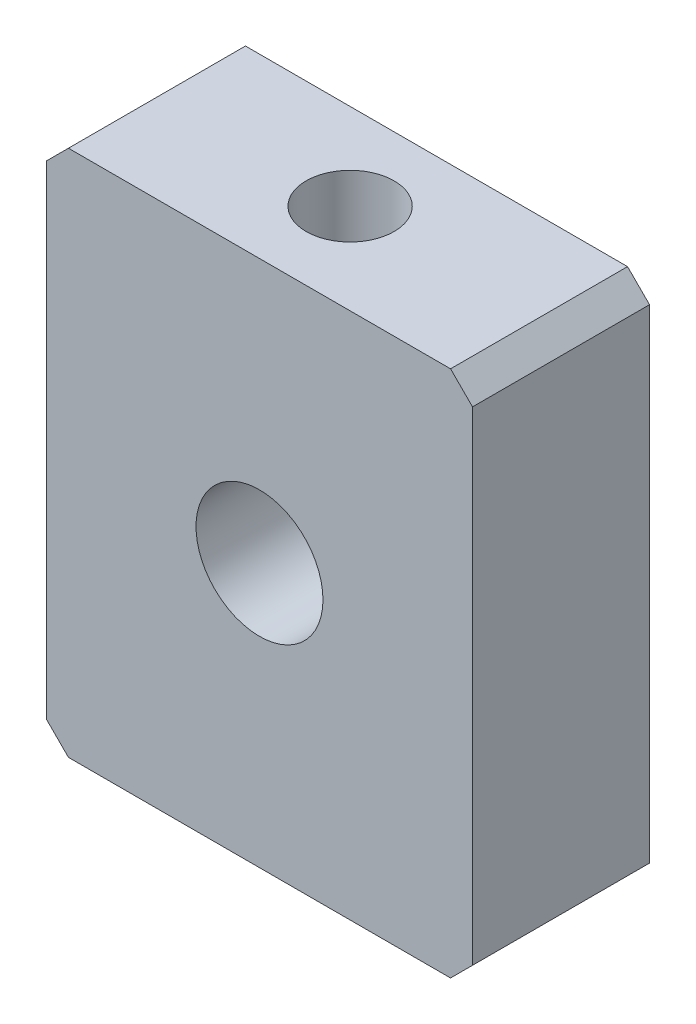
ISO-10303-21;
HEADER;
FILE_DESCRIPTION(('STEP AP214'),'2;1');
FILE_NAME('part.step','',(''),(''),'','','');
FILE_SCHEMA(('AUTOMOTIVE_DESIGN { 1 0 10303 214 1 1 1 1 }'));
ENDSEC;
DATA;
#1=APPLICATION_CONTEXT('core data for automotive mechanical design processes');
#2=APPLICATION_PROTOCOL_DEFINITION('international standard','automotive_design',2000,#1);
#3=PRODUCT_CONTEXT('',#1,'mechanical');
#4=PRODUCT('Part','Part','',(#3));
#5=PRODUCT_RELATED_PRODUCT_CATEGORY('part','',(#4));
#6=PRODUCT_DEFINITION_FORMATION('','',#4);
#7=PRODUCT_DEFINITION_CONTEXT('part definition',#1,'design');
#8=PRODUCT_DEFINITION('design','',#6,#7);
#9=PRODUCT_DEFINITION_SHAPE('','',#8);
#10=(LENGTH_UNIT() NAMED_UNIT(*) SI_UNIT(.MILLI.,.METRE.));
#11=(NAMED_UNIT(*) PLANE_ANGLE_UNIT() SI_UNIT($,.RADIAN.));
#12=(NAMED_UNIT(*) SI_UNIT($,.STERADIAN.) SOLID_ANGLE_UNIT());
#13=UNCERTAINTY_MEASURE_WITH_UNIT(LENGTH_MEASURE(1.E-05),#10,'distance_accuracy_value','');
#14=(GEOMETRIC_REPRESENTATION_CONTEXT(3) GLOBAL_UNCERTAINTY_ASSIGNED_CONTEXT((#13)) GLOBAL_UNIT_ASSIGNED_CONTEXT((#10,
#11,#12)) REPRESENTATION_CONTEXT('',''));
#15=CARTESIAN_POINT('',(0.,0.,0.));
#16=DIRECTION('',(0.,0.,1.));
#17=DIRECTION('',(1.,0.,0.));
#18=AXIS2_PLACEMENT_3D('',#15,#16,#17);
#19=CARTESIAN_POINT('',(0.,682.442102346235,-279.505091007785));
#20=DIRECTION('',(0.,-1.,0.));
#21=DIRECTION('',(0.,0.,-1.));
#22=AXIS2_PLACEMENT_3D('',#19,#20,#21);
#23=PLANE('',#22);
#24=CARTESIAN_POINT('',(-359.756516483997,682.442102346235,-105.61));
#25=DIRECTION('',(0.,1.,0.));
#26=DIRECTION('',(0.,0.,1.));
#27=AXIS2_PLACEMENT_3D('',#24,#25,#26);
#28=CIRCLE('',#27,9.99999999999975);
#29=CARTESIAN_POINT('',(-359.756516483997,682.442102346235,-95.6100000000002));
#30=VERTEX_POINT('',#29);
#31=EDGE_CURVE('E175',#30,#30,#28,.T.);
#32=ORIENTED_EDGE('',*,*,#31,.F.);
#33=EDGE_LOOP('',(#32));
#34=FACE_BOUND('',#33,.T.);
#35=DIRECTION('',(1.,0.,0.));
#36=VECTOR('',#35,1.);
#37=CARTESIAN_POINT('',(0.,682.442102346235,-85.));
#38=LINE('',#37,#36);
#39=CARTESIAN_POINT('',(-403.211516483998,682.442102346235,-85.));
#40=VERTEX_POINT('',#39);
#41=CARTESIAN_POINT('',(-316.301516483998,682.442102346235,-85.));
#42=VERTEX_POINT('',#41);
#43=EDGE_CURVE('E163',#40,#42,#38,.T.);
#44=ORIENTED_EDGE('',*,*,#43,.T.);
#45=DIRECTION('',(0.,0.,-1.));
#46=VECTOR('',#45,1.);
#47=CARTESIAN_POINT('',(-316.301516483998,682.442102346235,-279.505091007785));
#48=LINE('',#47,#46);
#49=CARTESIAN_POINT('',(-316.301516483998,682.442102346235,-125.26));
#50=VERTEX_POINT('',#49);
#51=EDGE_CURVE('E11',#42,#50,#48,.T.);
#52=ORIENTED_EDGE('',*,*,#51,.T.);
#53=DIRECTION('',(1.,0.,0.));
#54=VECTOR('',#53,1.);
#55=CARTESIAN_POINT('',(0.,682.442102346235,-125.26));
#56=LINE('',#55,#54);
#57=CARTESIAN_POINT('',(-403.211516483998,682.442102346235,-125.26));
#58=VERTEX_POINT('',#57);
#59=EDGE_CURVE('E130',#58,#50,#56,.T.);
#60=ORIENTED_EDGE('',*,*,#59,.F.);
#61=DIRECTION('',(0.,0.,1.));
#62=VECTOR('',#61,1.);
#63=CARTESIAN_POINT('',(-403.211516483998,682.442102346235,-279.505091007785));
#64=LINE('',#63,#62);
#65=EDGE_CURVE('E50',#58,#40,#64,.T.);
#66=ORIENTED_EDGE('',*,*,#65,.T.);
#67=EDGE_LOOP('',(#44,#52,#60,#66));
#68=FACE_BOUND('',#67,.T.);
#69=ADVANCED_FACE('F41',(#34,#68),#23,.F.);
#70=CARTESIAN_POINT('',(-311.301516483998,0.,-279.505091007785));
#71=DIRECTION('',(-1.,0.,0.));
#72=DIRECTION('',(0.,0.,1.));
#73=AXIS2_PLACEMENT_3D('',#70,#71,#72);
#74=PLANE('',#73);
#75=DIRECTION('',(0.,-1.,0.));
#76=VECTOR('',#75,1.);
#77=CARTESIAN_POINT('',(-311.301516483998,0.,-85.));
#78=LINE('',#77,#76);
#79=CARTESIAN_POINT('',(-311.301516483998,677.442102346234,-85.));
#80=VERTEX_POINT('',#79);
#81=CARTESIAN_POINT('',(-311.301516483998,567.442102346235,-85.));
#82=VERTEX_POINT('',#81);
#83=EDGE_CURVE('E169',#80,#82,#78,.T.);
#84=ORIENTED_EDGE('',*,*,#83,.T.);
#85=DIRECTION('',(0.,0.,-1.));
#86=VECTOR('',#85,1.);
#87=CARTESIAN_POINT('',(-311.301516483998,567.442102346235,-279.505091007785));
#88=LINE('',#87,#86);
#89=CARTESIAN_POINT('',(-311.301516483998,567.442102346235,-125.26));
#90=VERTEX_POINT('',#89);
#91=EDGE_CURVE('E57',#82,#90,#88,.T.);
#92=ORIENTED_EDGE('',*,*,#91,.T.);
#93=DIRECTION('',(0.,-1.,0.));
#94=VECTOR('',#93,1.);
#95=CARTESIAN_POINT('',(-311.301516483998,0.,-125.26));
#96=LINE('',#95,#94);
#97=CARTESIAN_POINT('',(-311.301516483998,677.442102346234,-125.26));
#98=VERTEX_POINT('',#97);
#99=EDGE_CURVE('E186',#98,#90,#96,.T.);
#100=ORIENTED_EDGE('',*,*,#99,.F.);
#101=DIRECTION('',(0.,0.,1.));
#102=VECTOR('',#101,1.);
#103=CARTESIAN_POINT('',(-311.301516483998,677.442102346234,-279.505091007785));
#104=LINE('',#103,#102);
#105=EDGE_CURVE('E119',#98,#80,#104,.T.);
#106=ORIENTED_EDGE('',*,*,#105,.T.);
#107=EDGE_LOOP('',(#84,#92,#100,#106));
#108=FACE_BOUND('',#107,.T.);
#109=ADVANCED_FACE('F191',(#108),#74,.F.);
#110=CARTESIAN_POINT('',(0.,562.442102346235,-279.505091007785));
#111=DIRECTION('',(0.,1.,0.));
#112=DIRECTION('',(0.,0.,1.));
#113=AXIS2_PLACEMENT_3D('',#110,#111,#112);
#114=PLANE('',#113);
#115=DIRECTION('',(-1.,0.,0.));
#116=VECTOR('',#115,1.);
#117=CARTESIAN_POINT('',(0.,562.442102346235,-85.));
#118=LINE('',#117,#116);
#119=CARTESIAN_POINT('',(-316.301516483998,562.442102346235,-85.));
#120=VERTEX_POINT('',#119);
#121=CARTESIAN_POINT('',(-403.211516483998,562.442102346235,-85.));
#122=VERTEX_POINT('',#121);
#123=EDGE_CURVE('E172',#120,#122,#118,.T.);
#124=ORIENTED_EDGE('',*,*,#123,.T.);
#125=DIRECTION('',(0.,0.,-1.));
#126=VECTOR('',#125,1.);
#127=CARTESIAN_POINT('',(-403.211516483998,562.442102346235,-279.505091007785));
#128=LINE('',#127,#126);
#129=CARTESIAN_POINT('',(-403.211516483998,562.442102346235,-125.26));
#130=VERTEX_POINT('',#129);
#131=EDGE_CURVE('E149',#122,#130,#128,.T.);
#132=ORIENTED_EDGE('',*,*,#131,.T.);
#133=DIRECTION('',(-1.,0.,0.));
#134=VECTOR('',#133,1.);
#135=CARTESIAN_POINT('',(0.,562.442102346235,-125.26));
#136=LINE('',#135,#134);
#137=CARTESIAN_POINT('',(-316.301516483998,562.442102346235,-125.26));
#138=VERTEX_POINT('',#137);
#139=EDGE_CURVE('E115',#138,#130,#136,.T.);
#140=ORIENTED_EDGE('',*,*,#139,.F.);
#141=DIRECTION('',(0.,0.,1.));
#142=VECTOR('',#141,1.);
#143=CARTESIAN_POINT('',(-316.301516483998,562.442102346235,-279.505091007785));
#144=LINE('',#143,#142);
#145=EDGE_CURVE('E146',#138,#120,#144,.T.);
#146=ORIENTED_EDGE('',*,*,#145,.T.);
#147=EDGE_LOOP('',(#124,#132,#140,#146));
#148=FACE_BOUND('',#147,.T.);
#149=ADVANCED_FACE('F199',(#148),#114,.F.);
#150=CARTESIAN_POINT('',(-359.756516483998,622.442102346234,-279.505091007785));
#151=DIRECTION('',(0.,0.,1.));
#152=DIRECTION('',(1.,0.,0.));
#153=AXIS2_PLACEMENT_3D('',#150,#151,#152);
#154=CYLINDRICAL_SURFACE('',#153,14.4381275614832);
#155=CARTESIAN_POINT('',(-359.756516483998,622.442102346234,-85.));
#156=DIRECTION('',(0.,0.,1.));
#157=DIRECTION('',(1.,0.,0.));
#158=AXIS2_PLACEMENT_3D('',#155,#156,#157);
#159=CIRCLE('',#158,14.4381275614832);
#160=CARTESIAN_POINT('',(-345.318388922515,622.442102346234,-85.));
#161=VERTEX_POINT('',#160);
#162=EDGE_CURVE('E180',#161,#161,#159,.T.);
#163=ORIENTED_EDGE('',*,*,#162,.T.);
#164=EDGE_LOOP('',(#163));
#165=FACE_BOUND('',#164,.T.);
#166=CARTESIAN_POINT('',(-359.756516483998,622.442102346234,-125.26));
#167=DIRECTION('',(0.,0.,-1.));
#168=DIRECTION('',(-1.,0.,0.));
#169=AXIS2_PLACEMENT_3D('',#166,#167,#168);
#170=CIRCLE('',#169,14.4381275614832);
#171=CARTESIAN_POINT('',(-374.194644045481,622.442102346234,-125.26));
#172=VERTEX_POINT('',#171);
#173=EDGE_CURVE('E139',#172,#172,#170,.F.);
#174=ORIENTED_EDGE('',*,*,#173,.F.);
#175=EDGE_LOOP('',(#174));
#176=FACE_BOUND('',#175,.T.);
#177=ADVANCED_FACE('F248',(#165,#176),#154,.F.);
#178=CARTESIAN_POINT('',(-408.211516483998,0.,-279.505091007785));
#179=DIRECTION('',(1.,0.,0.));
#180=DIRECTION('',(0.,0.,-1.));
#181=AXIS2_PLACEMENT_3D('',#178,#179,#180);
#182=PLANE('',#181);
#183=DIRECTION('',(0.,1.,0.));
#184=VECTOR('',#183,1.);
#185=CARTESIAN_POINT('',(-408.211516483998,0.,-125.26));
#186=LINE('',#185,#184);
#187=CARTESIAN_POINT('',(-408.211516483998,567.442102346235,-125.26));
#188=VERTEX_POINT('',#187);
#189=CARTESIAN_POINT('',(-408.211516483998,677.442102346234,-125.26));
#190=VERTEX_POINT('',#189);
#191=EDGE_CURVE('E112',#188,#190,#186,.T.);
#192=ORIENTED_EDGE('',*,*,#191,.F.);
#193=DIRECTION('',(0.,0.,1.));
#194=VECTOR('',#193,1.);
#195=CARTESIAN_POINT('',(-408.211516483998,567.442102346235,-279.505091007785));
#196=LINE('',#195,#194);
#197=CARTESIAN_POINT('',(-408.211516483998,567.442102346235,-85.));
#198=VERTEX_POINT('',#197);
#199=EDGE_CURVE('E126',#188,#198,#196,.T.);
#200=ORIENTED_EDGE('',*,*,#199,.T.);
#201=DIRECTION('',(0.,1.,0.));
#202=VECTOR('',#201,1.);
#203=CARTESIAN_POINT('',(-408.211516483998,0.,-85.));
#204=LINE('',#203,#202);
#205=CARTESIAN_POINT('',(-408.211516483998,677.442102346234,-85.));
#206=VERTEX_POINT('',#205);
#207=EDGE_CURVE('E131',#198,#206,#204,.T.);
#208=ORIENTED_EDGE('',*,*,#207,.T.);
#209=DIRECTION('',(0.,0.,-1.));
#210=VECTOR('',#209,1.);
#211=CARTESIAN_POINT('',(-408.211516483998,677.442102346234,-279.505091007785));
#212=LINE('',#211,#210);
#213=EDGE_CURVE('E129',#206,#190,#212,.T.);
#214=ORIENTED_EDGE('',*,*,#213,.T.);
#215=EDGE_LOOP('',(#192,#200,#208,#214));
#216=FACE_BOUND('',#215,.T.);
#217=ADVANCED_FACE('F124',(#216),#182,.F.);
#218=CARTESIAN_POINT('',(0.,0.,-85.));
#219=DIRECTION('',(0.,0.,1.));
#220=DIRECTION('',(1.,0.,0.));
#221=AXIS2_PLACEMENT_3D('',#218,#219,#220);
#222=PLANE('',#221);
#223=ORIENTED_EDGE('',*,*,#162,.F.);
#224=EDGE_LOOP('',(#223));
#225=FACE_BOUND('',#224,.T.);
#226=ORIENTED_EDGE('',*,*,#207,.F.);
#227=DIRECTION('',(-0.707106781186548,0.707106781186548,0.));
#228=VECTOR('',#227,1.);
#229=CARTESIAN_POINT('',(79.6152929311184,79.6152929311184,-85.));
#230=LINE('',#229,#228);
#231=EDGE_CURVE('E134',#198,#122,#230,.F.);
#232=ORIENTED_EDGE('',*,*,#231,.T.);
#233=ORIENTED_EDGE('',*,*,#123,.F.);
#234=DIRECTION('',(-0.707106781186548,-0.707106781186548,0.));
#235=VECTOR('',#234,1.);
#236=CARTESIAN_POINT('',(-439.371809415116,439.371809415116,-85.));
#237=LINE('',#236,#235);
#238=EDGE_CURVE('E143',#120,#82,#237,.F.);
#239=ORIENTED_EDGE('',*,*,#238,.T.);
#240=ORIENTED_EDGE('',*,*,#83,.F.);
#241=DIRECTION('',(0.707106781186544,-0.707106781186551,0.));
#242=VECTOR('',#241,1.);
#243=CARTESIAN_POINT('',(183.070292931117,183.070292931115,-85.));
#244=LINE('',#243,#242);
#245=EDGE_CURVE('E137',#80,#42,#244,.F.);
#246=ORIENTED_EDGE('',*,*,#245,.T.);
#247=ORIENTED_EDGE('',*,*,#43,.F.);
#248=DIRECTION('',(0.707106781186544,0.707106781186551,0.));
#249=VECTOR('',#248,1.);
#250=CARTESIAN_POINT('',(-542.826809415118,542.826809415112,-85.));
#251=LINE('',#250,#249);
#252=EDGE_CURVE('E135',#40,#206,#251,.F.);
#253=ORIENTED_EDGE('',*,*,#252,.T.);
#254=EDGE_LOOP('',(#226,#232,#233,#239,#240,#246,#247,#253));
#255=FACE_BOUND('',#254,.T.);
#256=ADVANCED_FACE('F167',(#225,#255),#222,.T.);
#257=CARTESIAN_POINT('',(95.1434835160164,370.,-125.26));
#258=DIRECTION('',(0.,0.,-1.));
#259=DIRECTION('',(-1.,0.,0.));
#260=AXIS2_PLACEMENT_3D('',#257,#258,#259);
#261=PLANE('',#260);
#262=ORIENTED_EDGE('',*,*,#139,.T.);
#263=DIRECTION('',(0.707106781186548,-0.707106781186548,0.));
#264=VECTOR('',#263,1.);
#265=CARTESIAN_POINT('',(-57.8129653108734,217.04355117311,-125.26));
#266=LINE('',#265,#264);
#267=EDGE_CURVE('E108',#130,#188,#266,.F.);
#268=ORIENTED_EDGE('',*,*,#267,.T.);
#269=ORIENTED_EDGE('',*,*,#191,.T.);
#270=DIRECTION('',(-0.707106781186544,-0.707106781186551,0.));
#271=VECTOR('',#270,1.);
#272=CARTESIAN_POINT('',(-310.255067657111,775.398551173123,-125.26));
#273=LINE('',#272,#271);
#274=EDGE_CURVE('E151',#190,#58,#273,.F.);
#275=ORIENTED_EDGE('',*,*,#274,.T.);
#276=ORIENTED_EDGE('',*,*,#59,.T.);
#277=DIRECTION('',(-0.707106781186544,0.707106781186551,0.));
#278=VECTOR('',#277,1.);
#279=CARTESIAN_POINT('',(45.6420346891243,320.498551173108,-125.26));
#280=LINE('',#279,#278);
#281=EDGE_CURVE('E64',#50,#98,#280,.F.);
#282=ORIENTED_EDGE('',*,*,#281,.T.);
#283=ORIENTED_EDGE('',*,*,#99,.T.);
#284=DIRECTION('',(0.707106781186548,0.707106781186548,0.));
#285=VECTOR('',#284,1.);
#286=CARTESIAN_POINT('',(-206.800067657108,671.943551173124,-125.26));
#287=LINE('',#286,#285);
#288=EDGE_CURVE('E120',#90,#138,#287,.F.);
#289=ORIENTED_EDGE('',*,*,#288,.T.);
#290=EDGE_LOOP('',(#262,#268,#269,#275,#276,#282,#283,#289));
#291=FACE_BOUND('',#290,.T.);
#292=ORIENTED_EDGE('',*,*,#173,.T.);
#293=EDGE_LOOP('',(#292));
#294=FACE_BOUND('',#293,.T.);
#295=ADVANCED_FACE('F110',(#291,#294),#261,.T.);
#296=CARTESIAN_POINT('',(-408.211516483998,567.442102346235,-279.505091007785));
#297=DIRECTION('',(0.707106781186547,0.707106781186547,0.));
#298=DIRECTION('',(0.,0.,1.));
#299=AXIS2_PLACEMENT_3D('',#296,#297,#298);
#300=PLANE('',#299);
#301=ORIENTED_EDGE('',*,*,#267,.F.);
#302=ORIENTED_EDGE('',*,*,#131,.F.);
#303=ORIENTED_EDGE('',*,*,#231,.F.);
#304=ORIENTED_EDGE('',*,*,#199,.F.);
#305=EDGE_LOOP('',(#301,#302,#303,#304));
#306=FACE_BOUND('',#305,.T.);
#307=ADVANCED_FACE('F133',(#306),#300,.F.);
#308=CARTESIAN_POINT('',(-316.301516483998,562.442102346235,-279.505091007785));
#309=DIRECTION('',(-0.707106781186547,0.707106781186547,0.));
#310=DIRECTION('',(0.,0.,1.));
#311=AXIS2_PLACEMENT_3D('',#308,#309,#310);
#312=PLANE('',#311);
#313=ORIENTED_EDGE('',*,*,#288,.F.);
#314=ORIENTED_EDGE('',*,*,#91,.F.);
#315=ORIENTED_EDGE('',*,*,#238,.F.);
#316=ORIENTED_EDGE('',*,*,#145,.F.);
#317=EDGE_LOOP('',(#313,#314,#315,#316));
#318=FACE_BOUND('',#317,.T.);
#319=ADVANCED_FACE('F197',(#318),#312,.F.);
#320=CARTESIAN_POINT('',(-311.301516483998,677.442102346234,-279.505091007785));
#321=DIRECTION('',(-0.707106781186551,-0.707106781186544,0.));
#322=DIRECTION('',(0.,0.,1.));
#323=AXIS2_PLACEMENT_3D('',#320,#321,#322);
#324=PLANE('',#323);
#325=ORIENTED_EDGE('',*,*,#281,.F.);
#326=ORIENTED_EDGE('',*,*,#51,.F.);
#327=ORIENTED_EDGE('',*,*,#245,.F.);
#328=ORIENTED_EDGE('',*,*,#105,.F.);
#329=EDGE_LOOP('',(#325,#326,#327,#328));
#330=FACE_BOUND('',#329,.T.);
#331=ADVANCED_FACE('F190',(#330),#324,.F.);
#332=CARTESIAN_POINT('',(-403.211516483998,682.442102346235,-279.505091007785));
#333=DIRECTION('',(0.707106781186551,-0.707106781186544,0.));
#334=DIRECTION('',(0.,0.,1.));
#335=AXIS2_PLACEMENT_3D('',#332,#333,#334);
#336=PLANE('',#335);
#337=ORIENTED_EDGE('',*,*,#274,.F.);
#338=ORIENTED_EDGE('',*,*,#213,.F.);
#339=ORIENTED_EDGE('',*,*,#252,.F.);
#340=ORIENTED_EDGE('',*,*,#65,.F.);
#341=EDGE_LOOP('',(#337,#338,#339,#340));
#342=FACE_BOUND('',#341,.T.);
#343=ADVANCED_FACE('F44',(#342),#336,.F.);
#344=CARTESIAN_POINT('',(-359.756516483997,662.442102346235,-105.61));
#345=DIRECTION('',(0.,1.,0.));
#346=DIRECTION('',(0.,0.,1.));
#347=AXIS2_PLACEMENT_3D('',#344,#345,#346);
#348=CYLINDRICAL_SURFACE('',#347,9.99999999999975);
#349=CARTESIAN_POINT('',(-359.756516483997,662.442102346235,-105.61));
#350=DIRECTION('',(0.,1.,0.));
#351=DIRECTION('',(0.,0.,1.));
#352=AXIS2_PLACEMENT_3D('',#349,#350,#351);
#353=CIRCLE('',#352,9.99999999999975);
#354=CARTESIAN_POINT('',(-359.756516483997,662.442102346235,-95.6100000000002));
#355=VERTEX_POINT('',#354);
#356=EDGE_CURVE('E170',#355,#355,#353,.T.);
#357=ORIENTED_EDGE('',*,*,#356,.F.);
#358=EDGE_LOOP('',(#357));
#359=FACE_BOUND('',#358,.T.);
#360=ORIENTED_EDGE('',*,*,#31,.T.);
#361=EDGE_LOOP('',(#360));
#362=FACE_BOUND('',#361,.T.);
#363=ADVANCED_FACE('F204',(#359,#362),#348,.F.);
#364=CARTESIAN_POINT('',(-359.756516483997,662.442102346235,-105.61));
#365=DIRECTION('',(0.,1.,0.));
#366=DIRECTION('',(0.,0.,1.));
#367=AXIS2_PLACEMENT_3D('',#364,#365,#366);
#368=PLANE('',#367);
#369=ORIENTED_EDGE('',*,*,#356,.T.);
#370=EDGE_LOOP('',(#369));
#371=FACE_BOUND('',#370,.T.);
#372=ADVANCED_FACE('F236',(#371),#368,.T.);
#373=CLOSED_SHELL('',(#69,#109,#149,#177,#217,#256,#295,#307,#319,#331,#343,#363,#372));
#374=MANIFOLD_SOLID_BREP('B2',#373);
#375=ADVANCED_BREP_SHAPE_REPRESENTATION('',(#18,#374),#14);
#376=SHAPE_DEFINITION_REPRESENTATION(#9,#375);
ENDSEC;
END-ISO-10303-21;
